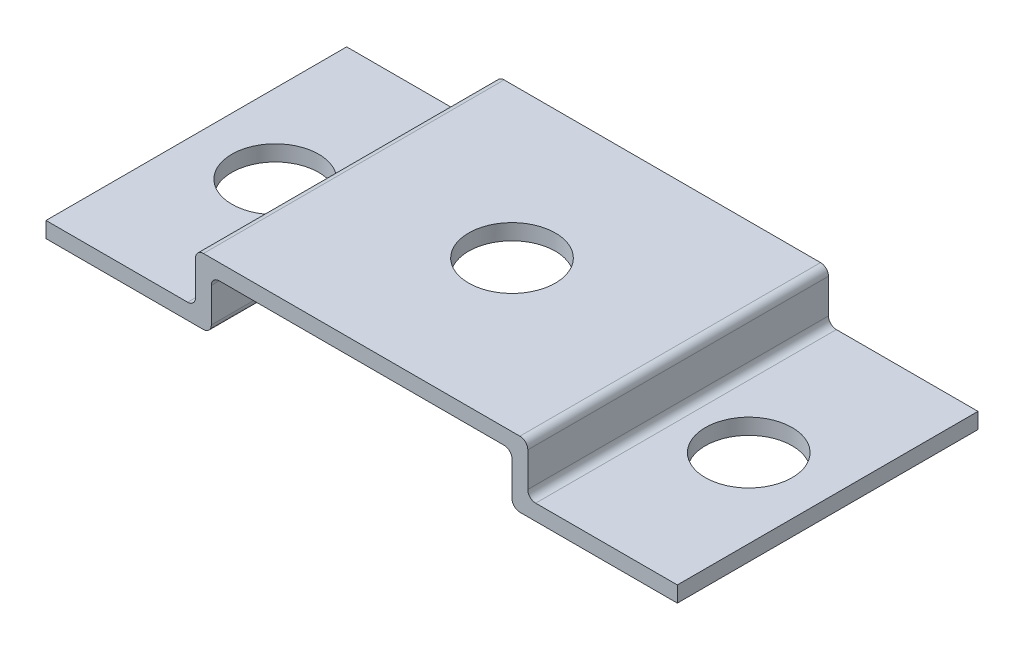
ISO-10303-21;
HEADER;
FILE_DESCRIPTION(('STEP AP214'),'2;1');
FILE_NAME('part.step','',(''),(''),'','','');
FILE_SCHEMA(('AUTOMOTIVE_DESIGN { 1 0 10303 214 1 1 1 1 }'));
ENDSEC;
DATA;
#1=APPLICATION_CONTEXT('core data for automotive mechanical design processes');
#2=APPLICATION_PROTOCOL_DEFINITION('international standard','automotive_design',2000,#1);
#3=PRODUCT_CONTEXT('',#1,'mechanical');
#4=PRODUCT('Part','Part','',(#3));
#5=PRODUCT_RELATED_PRODUCT_CATEGORY('part','',(#4));
#6=PRODUCT_DEFINITION_FORMATION('','',#4);
#7=PRODUCT_DEFINITION_CONTEXT('part definition',#1,'design');
#8=PRODUCT_DEFINITION('design','',#6,#7);
#9=PRODUCT_DEFINITION_SHAPE('','',#8);
#10=(LENGTH_UNIT() NAMED_UNIT(*) SI_UNIT(.MILLI.,.METRE.));
#11=(NAMED_UNIT(*) PLANE_ANGLE_UNIT() SI_UNIT($,.RADIAN.));
#12=(NAMED_UNIT(*) SI_UNIT($,.STERADIAN.) SOLID_ANGLE_UNIT());
#13=UNCERTAINTY_MEASURE_WITH_UNIT(LENGTH_MEASURE(1.E-05),#10,'distance_accuracy_value','');
#14=(GEOMETRIC_REPRESENTATION_CONTEXT(3) GLOBAL_UNCERTAINTY_ASSIGNED_CONTEXT((#13)) GLOBAL_UNIT_ASSIGNED_CONTEXT((#10,
#11,#12)) REPRESENTATION_CONTEXT('',''));
#15=CARTESIAN_POINT('',(0.,0.,0.));
#16=DIRECTION('',(0.,0.,1.));
#17=DIRECTION('',(1.,0.,0.));
#18=AXIS2_PLACEMENT_3D('',#15,#16,#17);
#19=CARTESIAN_POINT('',(0.,-1.,-19.05));
#20=DIRECTION('',(-1.,0.,0.));
#21=DIRECTION('',(0.,0.,1.));
#22=AXIS2_PLACEMENT_3D('',#19,#20,#21);
#23=PLANE('',#22);
#24=DIRECTION('',(0.,-1.,0.));
#25=VECTOR('',#24,1.);
#26=CARTESIAN_POINT('',(0.,-1.,0.));
#27=LINE('',#26,#25);
#28=CARTESIAN_POINT('',(0.,0.,0.));
#29=VERTEX_POINT('',#28);
#30=CARTESIAN_POINT('',(0.,-1.,0.));
#31=VERTEX_POINT('',#30);
#32=EDGE_CURVE('E233',#29,#31,#27,.T.);
#33=ORIENTED_EDGE('',*,*,#32,.F.);
#34=DIRECTION('',(0.,0.,1.));
#35=VECTOR('',#34,1.);
#36=CARTESIAN_POINT('',(0.,0.,-19.05));
#37=LINE('',#36,#35);
#38=CARTESIAN_POINT('',(0.,0.,-19.05));
#39=VERTEX_POINT('',#38);
#40=EDGE_CURVE('E199',#39,#29,#37,.T.);
#41=ORIENTED_EDGE('',*,*,#40,.F.);
#42=DIRECTION('',(0.,-1.,0.));
#43=VECTOR('',#42,1.);
#44=CARTESIAN_POINT('',(0.,-1.,-19.05));
#45=LINE('',#44,#43);
#46=CARTESIAN_POINT('',(0.,-1.,-19.05));
#47=VERTEX_POINT('',#46);
#48=EDGE_CURVE('E192',#39,#47,#45,.T.);
#49=ORIENTED_EDGE('',*,*,#48,.T.);
#50=DIRECTION('',(0.,0.,1.));
#51=VECTOR('',#50,1.);
#52=CARTESIAN_POINT('',(0.,-1.,-19.05));
#53=LINE('',#52,#51);
#54=EDGE_CURVE('E173',#47,#31,#53,.T.);
#55=ORIENTED_EDGE('',*,*,#54,.T.);
#56=EDGE_LOOP('',(#33,#41,#49,#55));
#57=FACE_BOUND('',#56,.T.);
#58=ADVANCED_FACE('F34',(#57),#23,.T.);
#59=CARTESIAN_POINT('',(0.,0.,-19.05));
#60=DIRECTION('',(0.,1.,0.));
#61=DIRECTION('',(0.,0.,1.));
#62=AXIS2_PLACEMENT_3D('',#59,#60,#61);
#63=PLANE('',#62);
#64=CARTESIAN_POINT('',(5.,0.,-9.525));
#65=DIRECTION('',(0.,1.,0.));
#66=DIRECTION('',(0.,0.,1.));
#67=AXIS2_PLACEMENT_3D('',#64,#65,#66);
#68=CIRCLE('',#67,2.75);
#69=CARTESIAN_POINT('',(5.,0.,-6.775));
#70=VERTEX_POINT('',#69);
#71=EDGE_CURVE('E625',#70,#70,#68,.T.);
#72=ORIENTED_EDGE('',*,*,#71,.F.);
#73=EDGE_LOOP('',(#72));
#74=FACE_BOUND('',#73,.T.);
#75=DIRECTION('',(-1.,0.,0.));
#76=VECTOR('',#75,1.);
#77=CARTESIAN_POINT('',(0.,0.,0.));
#78=LINE('',#77,#76);
#79=CARTESIAN_POINT('',(8.975,0.,0.));
#80=VERTEX_POINT('',#79);
#81=EDGE_CURVE('E200',#80,#29,#78,.T.);
#82=ORIENTED_EDGE('',*,*,#81,.F.);
#83=DIRECTION('',(0.,0.,1.));
#84=VECTOR('',#83,1.);
#85=CARTESIAN_POINT('',(8.975,0.,-19.05));
#86=LINE('',#85,#84);
#87=CARTESIAN_POINT('',(8.975,0.,-19.05));
#88=VERTEX_POINT('',#87);
#89=EDGE_CURVE('E301',#80,#88,#86,.F.);
#90=ORIENTED_EDGE('',*,*,#89,.T.);
#91=DIRECTION('',(-1.,0.,0.));
#92=VECTOR('',#91,1.);
#93=CARTESIAN_POINT('',(0.,0.,-19.05));
#94=LINE('',#93,#92);
#95=EDGE_CURVE('E186',#88,#39,#94,.T.);
#96=ORIENTED_EDGE('',*,*,#95,.T.);
#97=ORIENTED_EDGE('',*,*,#40,.T.);
#98=EDGE_LOOP('',(#82,#90,#96,#97));
#99=FACE_BOUND('',#98,.T.);
#100=ADVANCED_FACE('F348',(#74,#99),#63,.T.);
#101=CARTESIAN_POINT('',(9.475,0.,-19.05));
#102=DIRECTION('',(-1.,0.,0.));
#103=DIRECTION('',(0.,0.,1.));
#104=AXIS2_PLACEMENT_3D('',#101,#102,#103);
#105=PLANE('',#104);
#106=DIRECTION('',(0.,-1.,0.));
#107=VECTOR('',#106,1.);
#108=CARTESIAN_POINT('',(9.475,0.,-19.05));
#109=LINE('',#108,#107);
#110=CARTESIAN_POINT('',(9.475,2.675,-19.05));
#111=VERTEX_POINT('',#110);
#112=CARTESIAN_POINT('',(9.475,0.5,-19.05));
#113=VERTEX_POINT('',#112);
#114=EDGE_CURVE('E229',#111,#113,#109,.T.);
#115=ORIENTED_EDGE('',*,*,#114,.T.);
#116=DIRECTION('',(0.,0.,1.));
#117=VECTOR('',#116,1.);
#118=CARTESIAN_POINT('',(9.475,0.5,0.));
#119=LINE('',#118,#117);
#120=CARTESIAN_POINT('',(9.475,0.5,0.));
#121=VERTEX_POINT('',#120);
#122=EDGE_CURVE('E298',#113,#121,#119,.T.);
#123=ORIENTED_EDGE('',*,*,#122,.T.);
#124=DIRECTION('',(0.,-1.,0.));
#125=VECTOR('',#124,1.);
#126=CARTESIAN_POINT('',(9.475,0.,0.));
#127=LINE('',#126,#125);
#128=CARTESIAN_POINT('',(9.475,2.675,0.));
#129=VERTEX_POINT('',#128);
#130=EDGE_CURVE('E202',#129,#121,#127,.T.);
#131=ORIENTED_EDGE('',*,*,#130,.F.);
#132=DIRECTION('',(0.,0.,1.));
#133=VECTOR('',#132,1.);
#134=CARTESIAN_POINT('',(9.475,2.675,-19.05));
#135=LINE('',#134,#133);
#136=EDGE_CURVE('E296',#129,#111,#135,.F.);
#137=ORIENTED_EDGE('',*,*,#136,.T.);
#138=EDGE_LOOP('',(#115,#123,#131,#137));
#139=FACE_BOUND('',#138,.T.);
#140=ADVANCED_FACE('F356',(#139),#105,.T.);
#141=CARTESIAN_POINT('',(9.475,3.175,-19.05));
#142=DIRECTION('',(0.,1.,0.));
#143=DIRECTION('',(0.,0.,1.));
#144=AXIS2_PLACEMENT_3D('',#141,#142,#143);
#145=PLANE('',#144);
#146=CARTESIAN_POINT('',(20.,3.175,-9.525));
#147=DIRECTION('',(0.,1.,0.));
#148=DIRECTION('',(0.,0.,1.));
#149=AXIS2_PLACEMENT_3D('',#146,#147,#148);
#150=CIRCLE('',#149,2.75);
#151=CARTESIAN_POINT('',(20.,3.175,-6.77500000000001));
#152=VERTEX_POINT('',#151);
#153=EDGE_CURVE('E620',#152,#152,#150,.T.);
#154=ORIENTED_EDGE('',*,*,#153,.F.);
#155=EDGE_LOOP('',(#154));
#156=FACE_BOUND('',#155,.T.);
#157=DIRECTION('',(-1.,0.,0.));
#158=VECTOR('',#157,1.);
#159=CARTESIAN_POINT('',(9.475,3.175,0.));
#160=LINE('',#159,#158);
#161=CARTESIAN_POINT('',(30.025,3.175,0.));
#162=VERTEX_POINT('',#161);
#163=CARTESIAN_POINT('',(9.975,3.175,0.));
#164=VERTEX_POINT('',#163);
#165=EDGE_CURVE('E257',#162,#164,#160,.T.);
#166=ORIENTED_EDGE('',*,*,#165,.F.);
#167=DIRECTION('',(0.,0.,1.));
#168=VECTOR('',#167,1.);
#169=CARTESIAN_POINT('',(30.025,3.175,-19.05));
#170=LINE('',#169,#168);
#171=CARTESIAN_POINT('',(30.025,3.175,-19.05));
#172=VERTEX_POINT('',#171);
#173=EDGE_CURVE('E314',#162,#172,#170,.F.);
#174=ORIENTED_EDGE('',*,*,#173,.T.);
#175=DIRECTION('',(-1.,0.,0.));
#176=VECTOR('',#175,1.);
#177=CARTESIAN_POINT('',(9.475,3.175,-19.05));
#178=LINE('',#177,#176);
#179=CARTESIAN_POINT('',(9.975,3.175,-19.05));
#180=VERTEX_POINT('',#179);
#181=EDGE_CURVE('E226',#172,#180,#178,.T.);
#182=ORIENTED_EDGE('',*,*,#181,.T.);
#183=DIRECTION('',(0.,0.,1.));
#184=VECTOR('',#183,1.);
#185=CARTESIAN_POINT('',(9.975,3.175,-19.05));
#186=LINE('',#185,#184);
#187=EDGE_CURVE('E311',#180,#164,#186,.T.);
#188=ORIENTED_EDGE('',*,*,#187,.T.);
#189=EDGE_LOOP('',(#166,#174,#182,#188));
#190=FACE_BOUND('',#189,.T.);
#191=ADVANCED_FACE('F363',(#156,#190),#145,.T.);
#192=CARTESIAN_POINT('',(30.525,3.175,-19.05));
#193=DIRECTION('',(1.,0.,0.));
#194=DIRECTION('',(0.,0.,-1.));
#195=AXIS2_PLACEMENT_3D('',#192,#193,#194);
#196=PLANE('',#195);
#197=DIRECTION('',(0.,1.,0.));
#198=VECTOR('',#197,1.);
#199=CARTESIAN_POINT('',(30.525,3.175,0.));
#200=LINE('',#199,#198);
#201=CARTESIAN_POINT('',(30.525,0.5,0.));
#202=VERTEX_POINT('',#201);
#203=CARTESIAN_POINT('',(30.525,2.675,0.));
#204=VERTEX_POINT('',#203);
#205=EDGE_CURVE('E254',#202,#204,#200,.T.);
#206=ORIENTED_EDGE('',*,*,#205,.F.);
#207=DIRECTION('',(0.,0.,1.));
#208=VECTOR('',#207,1.);
#209=CARTESIAN_POINT('',(30.525,0.5,-19.05));
#210=LINE('',#209,#208);
#211=CARTESIAN_POINT('',(30.525,0.5,-19.05));
#212=VERTEX_POINT('',#211);
#213=EDGE_CURVE('E309',#202,#212,#210,.F.);
#214=ORIENTED_EDGE('',*,*,#213,.T.);
#215=DIRECTION('',(0.,1.,0.));
#216=VECTOR('',#215,1.);
#217=CARTESIAN_POINT('',(30.525,3.175,-19.05));
#218=LINE('',#217,#216);
#219=CARTESIAN_POINT('',(30.525,2.675,-19.05));
#220=VERTEX_POINT('',#219);
#221=EDGE_CURVE('E223',#212,#220,#218,.T.);
#222=ORIENTED_EDGE('',*,*,#221,.T.);
#223=DIRECTION('',(0.,0.,1.));
#224=VECTOR('',#223,1.);
#225=CARTESIAN_POINT('',(30.525,2.675,-19.05));
#226=LINE('',#225,#224);
#227=EDGE_CURVE('E306',#220,#204,#226,.T.);
#228=ORIENTED_EDGE('',*,*,#227,.T.);
#229=EDGE_LOOP('',(#206,#214,#222,#228));
#230=FACE_BOUND('',#229,.T.);
#231=ADVANCED_FACE('F373',(#230),#196,.T.);
#232=CARTESIAN_POINT('',(30.525,0.,-19.05));
#233=DIRECTION('',(0.,1.,0.));
#234=DIRECTION('',(0.,0.,1.));
#235=AXIS2_PLACEMENT_3D('',#232,#233,#234);
#236=PLANE('',#235);
#237=CARTESIAN_POINT('',(35.,0.,-9.525));
#238=DIRECTION('',(0.,1.,0.));
#239=DIRECTION('',(0.,0.,-1.));
#240=AXIS2_PLACEMENT_3D('',#237,#238,#239);
#241=CIRCLE('',#240,2.75);
#242=CARTESIAN_POINT('',(35.,0.,-12.275));
#243=VERTEX_POINT('',#242);
#244=EDGE_CURVE('E205',#243,#243,#241,.T.);
#245=ORIENTED_EDGE('',*,*,#244,.F.);
#246=EDGE_LOOP('',(#245));
#247=FACE_BOUND('',#246,.T.);
#248=DIRECTION('',(-1.,0.,0.));
#249=VECTOR('',#248,1.);
#250=CARTESIAN_POINT('',(30.525,0.,-19.05));
#251=LINE('',#250,#249);
#252=CARTESIAN_POINT('',(40.,0.,-19.05));
#253=VERTEX_POINT('',#252);
#254=CARTESIAN_POINT('',(31.025,0.,-19.05));
#255=VERTEX_POINT('',#254);
#256=EDGE_CURVE('E220',#253,#255,#251,.T.);
#257=ORIENTED_EDGE('',*,*,#256,.T.);
#258=DIRECTION('',(0.,0.,1.));
#259=VECTOR('',#258,1.);
#260=CARTESIAN_POINT('',(31.025,0.,0.));
#261=LINE('',#260,#259);
#262=CARTESIAN_POINT('',(31.025,0.,0.));
#263=VERTEX_POINT('',#262);
#264=EDGE_CURVE('E303',#255,#263,#261,.T.);
#265=ORIENTED_EDGE('',*,*,#264,.T.);
#266=DIRECTION('',(-1.,0.,0.));
#267=VECTOR('',#266,1.);
#268=CARTESIAN_POINT('',(30.525,0.,0.));
#269=LINE('',#268,#267);
#270=CARTESIAN_POINT('',(40.,0.,0.));
#271=VERTEX_POINT('',#270);
#272=EDGE_CURVE('E251',#271,#263,#269,.T.);
#273=ORIENTED_EDGE('',*,*,#272,.F.);
#274=DIRECTION('',(0.,0.,1.));
#275=VECTOR('',#274,1.);
#276=CARTESIAN_POINT('',(40.,0.,-19.05));
#277=LINE('',#276,#275);
#278=EDGE_CURVE('E264',#253,#271,#277,.T.);
#279=ORIENTED_EDGE('',*,*,#278,.F.);
#280=EDGE_LOOP('',(#257,#265,#273,#279));
#281=FACE_BOUND('',#280,.T.);
#282=ADVANCED_FACE('F381',(#247,#281),#236,.T.);
#283=CARTESIAN_POINT('',(40.,0.,-19.05));
#284=DIRECTION('',(1.,0.,0.));
#285=DIRECTION('',(0.,0.,-1.));
#286=AXIS2_PLACEMENT_3D('',#283,#284,#285);
#287=PLANE('',#286);
#288=DIRECTION('',(0.,1.,0.));
#289=VECTOR('',#288,1.);
#290=CARTESIAN_POINT('',(40.,0.,0.));
#291=LINE('',#290,#289);
#292=CARTESIAN_POINT('',(40.,-0.999999999999997,0.));
#293=VERTEX_POINT('',#292);
#294=EDGE_CURVE('E248',#293,#271,#291,.T.);
#295=ORIENTED_EDGE('',*,*,#294,.F.);
#296=DIRECTION('',(0.,0.,1.));
#297=VECTOR('',#296,1.);
#298=CARTESIAN_POINT('',(40.,-0.999999999999997,-19.05));
#299=LINE('',#298,#297);
#300=CARTESIAN_POINT('',(40.,-0.999999999999997,-19.05));
#301=VERTEX_POINT('',#300);
#302=EDGE_CURVE('E185',#301,#293,#299,.T.);
#303=ORIENTED_EDGE('',*,*,#302,.F.);
#304=DIRECTION('',(0.,1.,0.));
#305=VECTOR('',#304,1.);
#306=CARTESIAN_POINT('',(40.,0.,-19.05));
#307=LINE('',#306,#305);
#308=EDGE_CURVE('E217',#301,#253,#307,.T.);
#309=ORIENTED_EDGE('',*,*,#308,.T.);
#310=ORIENTED_EDGE('',*,*,#278,.T.);
#311=EDGE_LOOP('',(#295,#303,#309,#310));
#312=FACE_BOUND('',#311,.T.);
#313=ADVANCED_FACE('F388',(#312),#287,.T.);
#314=CARTESIAN_POINT('',(40.,-0.999999999999997,-19.05));
#315=DIRECTION('',(0.,-1.,0.));
#316=DIRECTION('',(0.,0.,-1.));
#317=AXIS2_PLACEMENT_3D('',#314,#315,#316);
#318=PLANE('',#317);
#319=CARTESIAN_POINT('',(35.,-1.,-9.525));
#320=DIRECTION('',(0.,1.,0.));
#321=DIRECTION('',(0.,0.,-1.));
#322=AXIS2_PLACEMENT_3D('',#319,#320,#321);
#323=CIRCLE('',#322,2.75);
#324=CARTESIAN_POINT('',(35.,-1.,-12.275));
#325=VERTEX_POINT('',#324);
#326=EDGE_CURVE('E627',#325,#325,#323,.T.);
#327=ORIENTED_EDGE('',*,*,#326,.T.);
#328=EDGE_LOOP('',(#327));
#329=FACE_BOUND('',#328,.T.);
#330=DIRECTION('',(1.,0.,0.));
#331=VECTOR('',#330,1.);
#332=CARTESIAN_POINT('',(40.,-0.999999999999997,0.));
#333=LINE('',#332,#331);
#334=CARTESIAN_POINT('',(30.025,-0.999999999999997,0.));
#335=VERTEX_POINT('',#334);
#336=EDGE_CURVE('E246',#335,#293,#333,.T.);
#337=ORIENTED_EDGE('',*,*,#336,.F.);
#338=DIRECTION('',(0.,0.,1.));
#339=VECTOR('',#338,1.);
#340=CARTESIAN_POINT('',(30.025,-0.999999999999997,-19.05));
#341=LINE('',#340,#339);
#342=CARTESIAN_POINT('',(30.025,-0.999999999999997,-19.05));
#343=VERTEX_POINT('',#342);
#344=EDGE_CURVE('E294',#335,#343,#341,.F.);
#345=ORIENTED_EDGE('',*,*,#344,.T.);
#346=DIRECTION('',(1.,0.,0.));
#347=VECTOR('',#346,1.);
#348=CARTESIAN_POINT('',(40.,-0.999999999999997,-19.05));
#349=LINE('',#348,#347);
#350=EDGE_CURVE('E215',#343,#301,#349,.T.);
#351=ORIENTED_EDGE('',*,*,#350,.T.);
#352=ORIENTED_EDGE('',*,*,#302,.T.);
#353=EDGE_LOOP('',(#337,#345,#351,#352));
#354=FACE_BOUND('',#353,.T.);
#355=ADVANCED_FACE('F391',(#329,#354),#318,.T.);
#356=CARTESIAN_POINT('',(29.525,-0.999999999999997,-19.05));
#357=DIRECTION('',(-1.,0.,0.));
#358=DIRECTION('',(0.,0.,1.));
#359=AXIS2_PLACEMENT_3D('',#356,#357,#358);
#360=PLANE('',#359);
#361=DIRECTION('',(0.,-1.,0.));
#362=VECTOR('',#361,1.);
#363=CARTESIAN_POINT('',(29.525,-0.999999999999997,-19.05));
#364=LINE('',#363,#362);
#365=CARTESIAN_POINT('',(29.525,1.675,-19.05));
#366=VERTEX_POINT('',#365);
#367=CARTESIAN_POINT('',(29.525,-0.499999999999998,-19.05));
#368=VERTEX_POINT('',#367);
#369=EDGE_CURVE('E212',#366,#368,#364,.T.);
#370=ORIENTED_EDGE('',*,*,#369,.T.);
#371=DIRECTION('',(0.,0.,1.));
#372=VECTOR('',#371,1.);
#373=CARTESIAN_POINT('',(29.525,-0.499999999999998,-19.05));
#374=LINE('',#373,#372);
#375=CARTESIAN_POINT('',(29.525,-0.499999999999998,0.));
#376=VERTEX_POINT('',#375);
#377=EDGE_CURVE('E291',#368,#376,#374,.T.);
#378=ORIENTED_EDGE('',*,*,#377,.T.);
#379=DIRECTION('',(0.,-1.,0.));
#380=VECTOR('',#379,1.);
#381=CARTESIAN_POINT('',(29.525,-0.999999999999997,0.));
#382=LINE('',#381,#380);
#383=CARTESIAN_POINT('',(29.525,1.675,0.));
#384=VERTEX_POINT('',#383);
#385=EDGE_CURVE('E243',#384,#376,#382,.T.);
#386=ORIENTED_EDGE('',*,*,#385,.F.);
#387=DIRECTION('',(0.,0.,1.));
#388=VECTOR('',#387,1.);
#389=CARTESIAN_POINT('',(29.525,1.675,-19.05));
#390=LINE('',#389,#388);
#391=EDGE_CURVE('E289',#384,#366,#390,.F.);
#392=ORIENTED_EDGE('',*,*,#391,.T.);
#393=EDGE_LOOP('',(#370,#378,#386,#392));
#394=FACE_BOUND('',#393,.T.);
#395=ADVANCED_FACE('F399',(#394),#360,.T.);
#396=CARTESIAN_POINT('',(29.525,2.175,-19.05));
#397=DIRECTION('',(0.,-1.,0.));
#398=DIRECTION('',(0.,0.,-1.));
#399=AXIS2_PLACEMENT_3D('',#396,#397,#398);
#400=PLANE('',#399);
#401=CARTESIAN_POINT('',(20.,2.175,-9.525));
#402=DIRECTION('',(0.,-1.,0.));
#403=DIRECTION('',(0.,0.,-1.));
#404=AXIS2_PLACEMENT_3D('',#401,#402,#403);
#405=CIRCLE('',#404,2.75);
#406=CARTESIAN_POINT('',(20.,2.175,-12.275));
#407=VERTEX_POINT('',#406);
#408=EDGE_CURVE('E38',#407,#407,#405,.T.);
#409=ORIENTED_EDGE('',*,*,#408,.F.);
#410=EDGE_LOOP('',(#409));
#411=FACE_BOUND('',#410,.T.);
#412=DIRECTION('',(1.,0.,0.));
#413=VECTOR('',#412,1.);
#414=CARTESIAN_POINT('',(29.525,2.175,-19.05));
#415=LINE('',#414,#413);
#416=CARTESIAN_POINT('',(10.975,2.175,-19.05));
#417=VERTEX_POINT('',#416);
#418=CARTESIAN_POINT('',(29.025,2.175,-19.05));
#419=VERTEX_POINT('',#418);
#420=EDGE_CURVE('E210',#417,#419,#415,.T.);
#421=ORIENTED_EDGE('',*,*,#420,.T.);
#422=DIRECTION('',(0.,0.,1.));
#423=VECTOR('',#422,1.);
#424=CARTESIAN_POINT('',(29.025,2.175,0.));
#425=LINE('',#424,#423);
#426=CARTESIAN_POINT('',(29.025,2.175,0.));
#427=VERTEX_POINT('',#426);
#428=EDGE_CURVE('E317',#419,#427,#425,.T.);
#429=ORIENTED_EDGE('',*,*,#428,.T.);
#430=DIRECTION('',(1.,0.,0.));
#431=VECTOR('',#430,1.);
#432=CARTESIAN_POINT('',(29.525,2.175,0.));
#433=LINE('',#432,#431);
#434=CARTESIAN_POINT('',(10.975,2.175,0.));
#435=VERTEX_POINT('',#434);
#436=EDGE_CURVE('E240',#435,#427,#433,.T.);
#437=ORIENTED_EDGE('',*,*,#436,.F.);
#438=DIRECTION('',(0.,0.,1.));
#439=VECTOR('',#438,1.);
#440=CARTESIAN_POINT('',(10.975,2.175,-19.05));
#441=LINE('',#440,#439);
#442=EDGE_CURVE('E57',#435,#417,#441,.F.);
#443=ORIENTED_EDGE('',*,*,#442,.T.);
#444=EDGE_LOOP('',(#421,#429,#437,#443));
#445=FACE_BOUND('',#444,.T.);
#446=ADVANCED_FACE('F336',(#411,#445),#400,.T.);
#447=CARTESIAN_POINT('',(10.475,2.175,-19.05));
#448=DIRECTION('',(1.,0.,0.));
#449=DIRECTION('',(0.,0.,-1.));
#450=AXIS2_PLACEMENT_3D('',#447,#448,#449);
#451=PLANE('',#450);
#452=DIRECTION('',(0.,1.,0.));
#453=VECTOR('',#452,1.);
#454=CARTESIAN_POINT('',(10.475,2.175,0.));
#455=LINE('',#454,#453);
#456=CARTESIAN_POINT('',(10.475,-0.499999999999998,0.));
#457=VERTEX_POINT('',#456);
#458=CARTESIAN_POINT('',(10.475,1.675,0.));
#459=VERTEX_POINT('',#458);
#460=EDGE_CURVE('E237',#457,#459,#455,.T.);
#461=ORIENTED_EDGE('',*,*,#460,.F.);
#462=DIRECTION('',(0.,0.,1.));
#463=VECTOR('',#462,1.);
#464=CARTESIAN_POINT('',(10.475,-0.499999999999998,-19.05));
#465=LINE('',#464,#463);
#466=CARTESIAN_POINT('',(10.475,-0.499999999999998,-19.05));
#467=VERTEX_POINT('',#466);
#468=EDGE_CURVE('E280',#457,#467,#465,.F.);
#469=ORIENTED_EDGE('',*,*,#468,.T.);
#470=DIRECTION('',(0.,1.,0.));
#471=VECTOR('',#470,1.);
#472=CARTESIAN_POINT('',(10.475,2.175,-19.05));
#473=LINE('',#472,#471);
#474=CARTESIAN_POINT('',(10.475,1.675,-19.05));
#475=VERTEX_POINT('',#474);
#476=EDGE_CURVE('E195',#467,#475,#473,.T.);
#477=ORIENTED_EDGE('',*,*,#476,.T.);
#478=DIRECTION('',(0.,0.,1.));
#479=VECTOR('',#478,1.);
#480=CARTESIAN_POINT('',(10.475,1.675,0.));
#481=LINE('',#480,#479);
#482=EDGE_CURVE('E277',#475,#459,#481,.T.);
#483=ORIENTED_EDGE('',*,*,#482,.T.);
#484=EDGE_LOOP('',(#461,#469,#477,#483));
#485=FACE_BOUND('',#484,.T.);
#486=ADVANCED_FACE('F341',(#485),#451,.T.);
#487=CARTESIAN_POINT('',(10.475,-0.999999999999997,-19.05));
#488=DIRECTION('',(0.,-1.,0.));
#489=DIRECTION('',(1.,0.,0.));
#490=AXIS2_PLACEMENT_3D('',#487,#488,#489);
#491=PLANE('',#490);
#492=CARTESIAN_POINT('',(5.,-1.,-9.525));
#493=DIRECTION('',(0.,1.,0.));
#494=DIRECTION('',(0.,0.,1.));
#495=AXIS2_PLACEMENT_3D('',#492,#493,#494);
#496=CIRCLE('',#495,2.75);
#497=CARTESIAN_POINT('',(5.,-1.,-6.775));
#498=VERTEX_POINT('',#497);
#499=EDGE_CURVE('E235',#498,#498,#496,.T.);
#500=ORIENTED_EDGE('',*,*,#499,.T.);
#501=EDGE_LOOP('',(#500));
#502=FACE_BOUND('',#501,.T.);
#503=DIRECTION('',(1.,0.,0.));
#504=VECTOR('',#503,1.);
#505=CARTESIAN_POINT('',(10.475,-0.999999999999997,-19.05));
#506=LINE('',#505,#504);
#507=CARTESIAN_POINT('',(9.975,-0.999999999999998,-19.05));
#508=VERTEX_POINT('',#507);
#509=EDGE_CURVE('E177',#47,#508,#506,.T.);
#510=ORIENTED_EDGE('',*,*,#509,.T.);
#511=DIRECTION('',(0.,0.,1.));
#512=VECTOR('',#511,1.);
#513=CARTESIAN_POINT('',(9.975,-0.999999999999998,-19.05));
#514=LINE('',#513,#512);
#515=CARTESIAN_POINT('',(9.975,-0.999999999999998,0.));
#516=VERTEX_POINT('',#515);
#517=EDGE_CURVE('E263',#508,#516,#514,.T.);
#518=ORIENTED_EDGE('',*,*,#517,.T.);
#519=DIRECTION('',(1.,0.,0.));
#520=VECTOR('',#519,1.);
#521=CARTESIAN_POINT('',(10.475,-0.999999999999997,0.));
#522=LINE('',#521,#520);
#523=EDGE_CURVE('E180',#31,#516,#522,.T.);
#524=ORIENTED_EDGE('',*,*,#523,.F.);
#525=ORIENTED_EDGE('',*,*,#54,.F.);
#526=EDGE_LOOP('',(#510,#518,#524,#525));
#527=FACE_BOUND('',#526,.T.);
#528=ADVANCED_FACE('F175',(#502,#527),#491,.T.);
#529=CARTESIAN_POINT('',(0.,0.,-19.05));
#530=DIRECTION('',(0.,0.,-1.));
#531=DIRECTION('',(-1.,0.,0.));
#532=AXIS2_PLACEMENT_3D('',#529,#530,#531);
#533=PLANE('',#532);
#534=ORIENTED_EDGE('',*,*,#476,.F.);
#535=CARTESIAN_POINT('',(9.975,-0.499999999999998,-19.05));
#536=DIRECTION('',(0.,0.,-1.));
#537=DIRECTION('',(-1.,0.,0.));
#538=AXIS2_PLACEMENT_3D('',#535,#536,#537);
#539=CIRCLE('',#538,0.5);
#540=EDGE_CURVE('E194',#467,#508,#539,.T.);
#541=ORIENTED_EDGE('',*,*,#540,.T.);
#542=ORIENTED_EDGE('',*,*,#509,.F.);
#543=ORIENTED_EDGE('',*,*,#48,.F.);
#544=ORIENTED_EDGE('',*,*,#95,.F.);
#545=CARTESIAN_POINT('',(8.975,0.5,-19.05));
#546=DIRECTION('',(0.,0.,-1.));
#547=DIRECTION('',(-1.,0.,0.));
#548=AXIS2_PLACEMENT_3D('',#545,#546,#547);
#549=CIRCLE('',#548,0.5);
#550=EDGE_CURVE('E322',#88,#113,#549,.F.);
#551=ORIENTED_EDGE('',*,*,#550,.T.);
#552=ORIENTED_EDGE('',*,*,#114,.F.);
#553=CARTESIAN_POINT('',(9.975,2.675,-19.05));
#554=DIRECTION('',(0.,0.,-1.));
#555=DIRECTION('',(-1.,0.,0.));
#556=AXIS2_PLACEMENT_3D('',#553,#554,#555);
#557=CIRCLE('',#556,0.5);
#558=EDGE_CURVE('E282',#111,#180,#557,.T.);
#559=ORIENTED_EDGE('',*,*,#558,.T.);
#560=ORIENTED_EDGE('',*,*,#181,.F.);
#561=CARTESIAN_POINT('',(30.025,2.675,-19.05));
#562=DIRECTION('',(0.,0.,-1.));
#563=DIRECTION('',(-1.,0.,0.));
#564=AXIS2_PLACEMENT_3D('',#561,#562,#563);
#565=CIRCLE('',#564,0.5);
#566=EDGE_CURVE('E284',#172,#220,#565,.T.);
#567=ORIENTED_EDGE('',*,*,#566,.T.);
#568=ORIENTED_EDGE('',*,*,#221,.F.);
#569=CARTESIAN_POINT('',(31.025,0.5,-19.05));
#570=DIRECTION('',(0.,0.,-1.));
#571=DIRECTION('',(-1.,0.,0.));
#572=AXIS2_PLACEMENT_3D('',#569,#570,#571);
#573=CIRCLE('',#572,0.5);
#574=EDGE_CURVE('E326',#212,#255,#573,.F.);
#575=ORIENTED_EDGE('',*,*,#574,.T.);
#576=ORIENTED_EDGE('',*,*,#256,.F.);
#577=ORIENTED_EDGE('',*,*,#308,.F.);
#578=ORIENTED_EDGE('',*,*,#350,.F.);
#579=CARTESIAN_POINT('',(30.025,-0.499999999999998,-19.05));
#580=DIRECTION('',(0.,0.,-1.));
#581=DIRECTION('',(-1.,0.,0.));
#582=AXIS2_PLACEMENT_3D('',#579,#580,#581);
#583=CIRCLE('',#582,0.5);
#584=EDGE_CURVE('E286',#343,#368,#583,.T.);
#585=ORIENTED_EDGE('',*,*,#584,.T.);
#586=ORIENTED_EDGE('',*,*,#369,.F.);
#587=CARTESIAN_POINT('',(29.025,1.675,-19.05));
#588=DIRECTION('',(0.,0.,-1.));
#589=DIRECTION('',(-1.,0.,0.));
#590=AXIS2_PLACEMENT_3D('',#587,#588,#589);
#591=CIRCLE('',#590,0.5);
#592=EDGE_CURVE('E50',#366,#419,#591,.F.);
#593=ORIENTED_EDGE('',*,*,#592,.T.);
#594=ORIENTED_EDGE('',*,*,#420,.F.);
#595=CARTESIAN_POINT('',(10.975,1.675,-19.05));
#596=DIRECTION('',(0.,0.,-1.));
#597=DIRECTION('',(-1.,0.,0.));
#598=AXIS2_PLACEMENT_3D('',#595,#596,#597);
#599=CIRCLE('',#598,0.5);
#600=EDGE_CURVE('E11',#417,#475,#599,.F.);
#601=ORIENTED_EDGE('',*,*,#600,.T.);
#602=EDGE_LOOP('',(#534,#541,#542,#543,#544,#551,#552,#559,#560,#567,#568,#575,#576,#577,#578,
#585,#586,#593,#594,#601));
#603=FACE_BOUND('',#602,.T.);
#604=ADVANCED_FACE('F190',(#603),#533,.T.);
#605=CARTESIAN_POINT('',(0.,0.,0.));
#606=DIRECTION('',(0.,0.,-1.));
#607=DIRECTION('',(-1.,0.,0.));
#608=AXIS2_PLACEMENT_3D('',#605,#606,#607);
#609=PLANE('',#608);
#610=ORIENTED_EDGE('',*,*,#523,.T.);
#611=CARTESIAN_POINT('',(9.975,-0.499999999999998,0.));
#612=DIRECTION('',(0.,0.,-1.));
#613=DIRECTION('',(-1.,0.,0.));
#614=AXIS2_PLACEMENT_3D('',#611,#612,#613);
#615=CIRCLE('',#614,0.5);
#616=EDGE_CURVE('E275',#516,#457,#615,.F.);
#617=ORIENTED_EDGE('',*,*,#616,.T.);
#618=ORIENTED_EDGE('',*,*,#460,.T.);
#619=CARTESIAN_POINT('',(10.975,1.675,0.));
#620=DIRECTION('',(0.,0.,-1.));
#621=DIRECTION('',(-1.,0.,0.));
#622=AXIS2_PLACEMENT_3D('',#619,#620,#621);
#623=CIRCLE('',#622,0.5);
#624=EDGE_CURVE('E43',#459,#435,#623,.T.);
#625=ORIENTED_EDGE('',*,*,#624,.T.);
#626=ORIENTED_EDGE('',*,*,#436,.T.);
#627=CARTESIAN_POINT('',(29.025,1.675,0.));
#628=DIRECTION('',(0.,0.,-1.));
#629=DIRECTION('',(-1.,0.,0.));
#630=AXIS2_PLACEMENT_3D('',#627,#628,#629);
#631=CIRCLE('',#630,0.5);
#632=EDGE_CURVE('E328',#427,#384,#631,.T.);
#633=ORIENTED_EDGE('',*,*,#632,.T.);
#634=ORIENTED_EDGE('',*,*,#385,.T.);
#635=CARTESIAN_POINT('',(30.025,-0.499999999999998,0.));
#636=DIRECTION('',(0.,0.,-1.));
#637=DIRECTION('',(-1.,0.,0.));
#638=AXIS2_PLACEMENT_3D('',#635,#636,#637);
#639=CIRCLE('',#638,0.5);
#640=EDGE_CURVE('E273',#376,#335,#639,.F.);
#641=ORIENTED_EDGE('',*,*,#640,.T.);
#642=ORIENTED_EDGE('',*,*,#336,.T.);
#643=ORIENTED_EDGE('',*,*,#294,.T.);
#644=ORIENTED_EDGE('',*,*,#272,.T.);
#645=CARTESIAN_POINT('',(31.025,0.5,0.));
#646=DIRECTION('',(0.,0.,-1.));
#647=DIRECTION('',(-1.,0.,0.));
#648=AXIS2_PLACEMENT_3D('',#645,#646,#647);
#649=CIRCLE('',#648,0.5);
#650=EDGE_CURVE('E324',#263,#202,#649,.T.);
#651=ORIENTED_EDGE('',*,*,#650,.T.);
#652=ORIENTED_EDGE('',*,*,#205,.T.);
#653=CARTESIAN_POINT('',(30.025,2.675,0.));
#654=DIRECTION('',(0.,0.,-1.));
#655=DIRECTION('',(-1.,0.,0.));
#656=AXIS2_PLACEMENT_3D('',#653,#654,#655);
#657=CIRCLE('',#656,0.5);
#658=EDGE_CURVE('E271',#204,#162,#657,.F.);
#659=ORIENTED_EDGE('',*,*,#658,.T.);
#660=ORIENTED_EDGE('',*,*,#165,.T.);
#661=CARTESIAN_POINT('',(9.975,2.675,0.));
#662=DIRECTION('',(0.,0.,-1.));
#663=DIRECTION('',(-1.,0.,0.));
#664=AXIS2_PLACEMENT_3D('',#661,#662,#663);
#665=CIRCLE('',#664,0.5);
#666=EDGE_CURVE('E269',#164,#129,#665,.F.);
#667=ORIENTED_EDGE('',*,*,#666,.T.);
#668=ORIENTED_EDGE('',*,*,#130,.T.);
#669=CARTESIAN_POINT('',(8.975,0.5,0.));
#670=DIRECTION('',(0.,0.,-1.));
#671=DIRECTION('',(-1.,0.,0.));
#672=AXIS2_PLACEMENT_3D('',#669,#670,#671);
#673=CIRCLE('',#672,0.5);
#674=EDGE_CURVE('E320',#121,#80,#673,.T.);
#675=ORIENTED_EDGE('',*,*,#674,.T.);
#676=ORIENTED_EDGE('',*,*,#81,.T.);
#677=ORIENTED_EDGE('',*,*,#32,.T.);
#678=EDGE_LOOP('',(#610,#617,#618,#625,#626,#633,#634,#641,#642,#643,#644,#651,#652,#659,#660,
#667,#668,#675,#676,#677));
#679=FACE_BOUND('',#678,.T.);
#680=ADVANCED_FACE('F332',(#679),#609,.F.);
#681=CARTESIAN_POINT('',(9.975,-0.499999999999998,-19.05));
#682=DIRECTION('',(0.,0.,1.));
#683=DIRECTION('',(1.,0.,0.));
#684=AXIS2_PLACEMENT_3D('',#681,#682,#683);
#685=CYLINDRICAL_SURFACE('',#684,0.5);
#686=ORIENTED_EDGE('',*,*,#540,.F.);
#687=ORIENTED_EDGE('',*,*,#468,.F.);
#688=ORIENTED_EDGE('',*,*,#616,.F.);
#689=ORIENTED_EDGE('',*,*,#517,.F.);
#690=EDGE_LOOP('',(#686,#687,#688,#689));
#691=FACE_BOUND('',#690,.T.);
#692=ADVANCED_FACE('F344',(#691),#685,.T.);
#693=CARTESIAN_POINT('',(30.025,-0.499999999999998,-19.05));
#694=DIRECTION('',(0.,0.,1.));
#695=DIRECTION('',(1.,0.,0.));
#696=AXIS2_PLACEMENT_3D('',#693,#694,#695);
#697=CYLINDRICAL_SURFACE('',#696,0.5);
#698=ORIENTED_EDGE('',*,*,#584,.F.);
#699=ORIENTED_EDGE('',*,*,#344,.F.);
#700=ORIENTED_EDGE('',*,*,#640,.F.);
#701=ORIENTED_EDGE('',*,*,#377,.F.);
#702=EDGE_LOOP('',(#698,#699,#700,#701));
#703=FACE_BOUND('',#702,.T.);
#704=ADVANCED_FACE('F396',(#703),#697,.T.);
#705=CARTESIAN_POINT('',(8.975,0.5,-19.05));
#706=DIRECTION('',(0.,0.,-1.));
#707=DIRECTION('',(-1.,0.,0.));
#708=AXIS2_PLACEMENT_3D('',#705,#706,#707);
#709=CYLINDRICAL_SURFACE('',#708,0.5);
#710=ORIENTED_EDGE('',*,*,#550,.F.);
#711=ORIENTED_EDGE('',*,*,#89,.F.);
#712=ORIENTED_EDGE('',*,*,#674,.F.);
#713=ORIENTED_EDGE('',*,*,#122,.F.);
#714=EDGE_LOOP('',(#710,#711,#712,#713));
#715=FACE_BOUND('',#714,.T.);
#716=ADVANCED_FACE('F353',(#715),#709,.F.);
#717=CARTESIAN_POINT('',(31.025,0.5,-19.05));
#718=DIRECTION('',(0.,0.,-1.));
#719=DIRECTION('',(-1.,0.,0.));
#720=AXIS2_PLACEMENT_3D('',#717,#718,#719);
#721=CYLINDRICAL_SURFACE('',#720,0.5);
#722=ORIENTED_EDGE('',*,*,#574,.F.);
#723=ORIENTED_EDGE('',*,*,#213,.F.);
#724=ORIENTED_EDGE('',*,*,#650,.F.);
#725=ORIENTED_EDGE('',*,*,#264,.F.);
#726=EDGE_LOOP('',(#722,#723,#724,#725));
#727=FACE_BOUND('',#726,.T.);
#728=ADVANCED_FACE('F379',(#727),#721,.F.);
#729=CARTESIAN_POINT('',(30.025,2.675,-19.05));
#730=DIRECTION('',(0.,0.,1.));
#731=DIRECTION('',(1.,0.,0.));
#732=AXIS2_PLACEMENT_3D('',#729,#730,#731);
#733=CYLINDRICAL_SURFACE('',#732,0.5);
#734=ORIENTED_EDGE('',*,*,#566,.F.);
#735=ORIENTED_EDGE('',*,*,#173,.F.);
#736=ORIENTED_EDGE('',*,*,#658,.F.);
#737=ORIENTED_EDGE('',*,*,#227,.F.);
#738=EDGE_LOOP('',(#734,#735,#736,#737));
#739=FACE_BOUND('',#738,.T.);
#740=ADVANCED_FACE('F370',(#739),#733,.T.);
#741=CARTESIAN_POINT('',(29.025,1.675,-19.05));
#742=DIRECTION('',(0.,0.,-1.));
#743=DIRECTION('',(-1.,0.,0.));
#744=AXIS2_PLACEMENT_3D('',#741,#742,#743);
#745=CYLINDRICAL_SURFACE('',#744,0.5);
#746=ORIENTED_EDGE('',*,*,#592,.F.);
#747=ORIENTED_EDGE('',*,*,#391,.F.);
#748=ORIENTED_EDGE('',*,*,#632,.F.);
#749=ORIENTED_EDGE('',*,*,#428,.F.);
#750=EDGE_LOOP('',(#746,#747,#748,#749));
#751=FACE_BOUND('',#750,.T.);
#752=ADVANCED_FACE('F402',(#751),#745,.F.);
#753=CARTESIAN_POINT('',(10.975,1.675,-19.05));
#754=DIRECTION('',(0.,0.,-1.));
#755=DIRECTION('',(-1.,0.,0.));
#756=AXIS2_PLACEMENT_3D('',#753,#754,#755);
#757=CYLINDRICAL_SURFACE('',#756,0.5);
#758=ORIENTED_EDGE('',*,*,#600,.F.);
#759=ORIENTED_EDGE('',*,*,#442,.F.);
#760=ORIENTED_EDGE('',*,*,#624,.F.);
#761=ORIENTED_EDGE('',*,*,#482,.F.);
#762=EDGE_LOOP('',(#758,#759,#760,#761));
#763=FACE_BOUND('',#762,.T.);
#764=ADVANCED_FACE('F339',(#763),#757,.F.);
#765=CARTESIAN_POINT('',(9.975,2.675,-19.05));
#766=DIRECTION('',(0.,0.,1.));
#767=DIRECTION('',(1.,0.,0.));
#768=AXIS2_PLACEMENT_3D('',#765,#766,#767);
#769=CYLINDRICAL_SURFACE('',#768,0.5);
#770=ORIENTED_EDGE('',*,*,#558,.F.);
#771=ORIENTED_EDGE('',*,*,#136,.F.);
#772=ORIENTED_EDGE('',*,*,#666,.F.);
#773=ORIENTED_EDGE('',*,*,#187,.F.);
#774=EDGE_LOOP('',(#770,#771,#772,#773));
#775=FACE_BOUND('',#774,.T.);
#776=ADVANCED_FACE('F36',(#775),#769,.T.);
#777=CARTESIAN_POINT('',(5.,-1.,-9.525));
#778=DIRECTION('',(0.,1.,0.));
#779=DIRECTION('',(0.,0.,1.));
#780=AXIS2_PLACEMENT_3D('',#777,#778,#779);
#781=CYLINDRICAL_SURFACE('',#780,2.75);
#782=ORIENTED_EDGE('',*,*,#499,.F.);
#783=EDGE_LOOP('',(#782));
#784=FACE_BOUND('',#783,.T.);
#785=ORIENTED_EDGE('',*,*,#71,.T.);
#786=EDGE_LOOP('',(#785));
#787=FACE_BOUND('',#786,.T.);
#788=ADVANCED_FACE('F454',(#784,#787),#781,.F.);
#789=CARTESIAN_POINT('',(35.,-1.,-9.525));
#790=DIRECTION('',(0.,1.,0.));
#791=DIRECTION('',(0.,0.,1.));
#792=AXIS2_PLACEMENT_3D('',#789,#790,#791);
#793=CYLINDRICAL_SURFACE('',#792,2.75);
#794=ORIENTED_EDGE('',*,*,#326,.F.);
#795=EDGE_LOOP('',(#794));
#796=FACE_BOUND('',#795,.T.);
#797=ORIENTED_EDGE('',*,*,#244,.T.);
#798=EDGE_LOOP('',(#797));
#799=FACE_BOUND('',#798,.T.);
#800=ADVANCED_FACE('F507',(#796,#799),#793,.F.);
#801=CARTESIAN_POINT('',(20.,-1.,-9.525));
#802=DIRECTION('',(0.,1.,0.));
#803=DIRECTION('',(0.,0.,1.));
#804=AXIS2_PLACEMENT_3D('',#801,#802,#803);
#805=CYLINDRICAL_SURFACE('',#804,2.75);
#806=ORIENTED_EDGE('',*,*,#408,.T.);
#807=EDGE_LOOP('',(#806));
#808=FACE_BOUND('',#807,.T.);
#809=ORIENTED_EDGE('',*,*,#153,.T.);
#810=EDGE_LOOP('',(#809));
#811=FACE_BOUND('',#810,.T.);
#812=ADVANCED_FACE('F517',(#808,#811),#805,.F.);
#813=CLOSED_SHELL('',(#58,#100,#140,#191,#231,#282,#313,#355,#395,#446,#486,#528,#604,#680,#692,
#704,#716,#728,#740,#752,#764,#776,#788,#800,#812));
#814=MANIFOLD_SOLID_BREP('B2',#813);
#815=ADVANCED_BREP_SHAPE_REPRESENTATION('',(#18,#814),#14);
#816=SHAPE_DEFINITION_REPRESENTATION(#9,#815);
ENDSEC;
END-ISO-10303-21;
